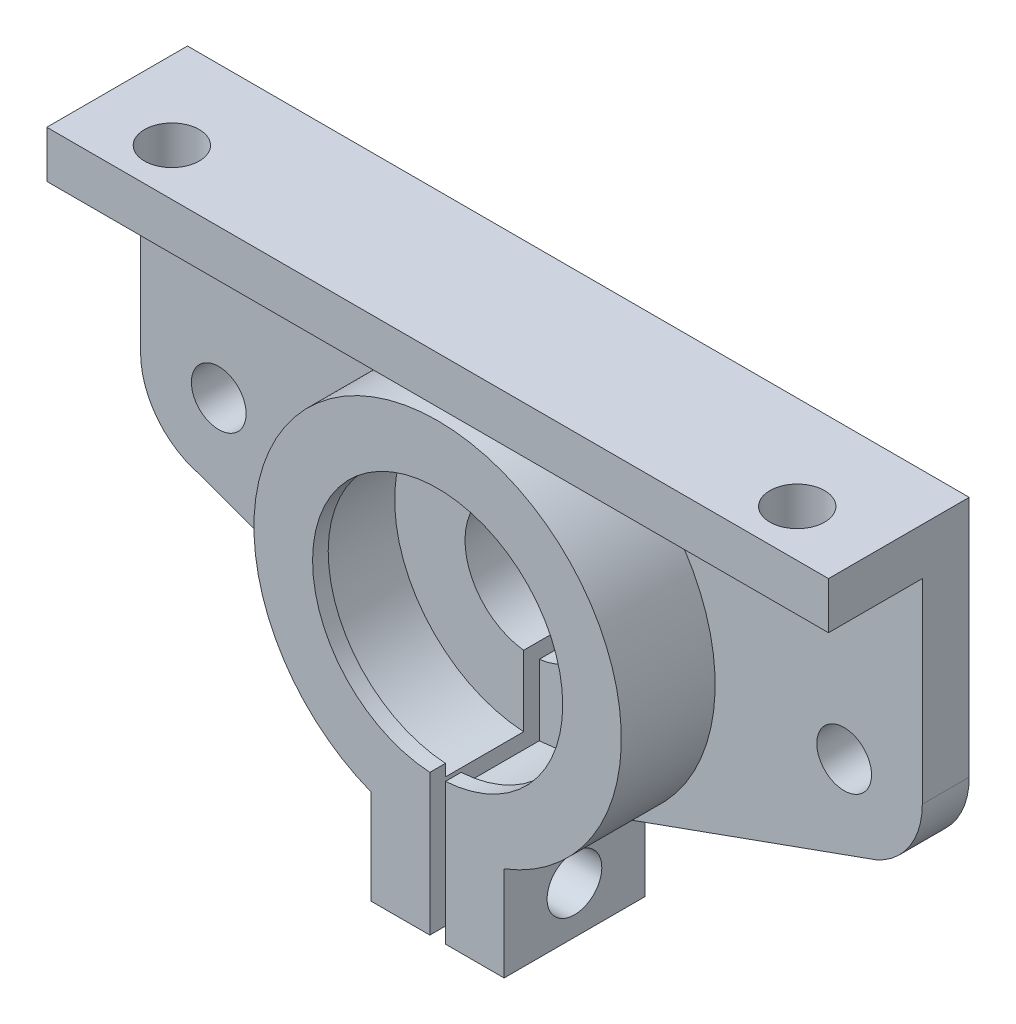
ISO-10303-21;
HEADER;
FILE_DESCRIPTION(('STEP AP214'),'2;1');
FILE_NAME('part.step','',(''),(''),'','','');
FILE_SCHEMA(('AUTOMOTIVE_DESIGN { 1 0 10303 214 1 1 1 1 }'));
ENDSEC;
DATA;
#1=APPLICATION_CONTEXT('core data for automotive mechanical design processes');
#2=APPLICATION_PROTOCOL_DEFINITION('international standard','automotive_design',2000,#1);
#3=PRODUCT_CONTEXT('',#1,'mechanical');
#4=PRODUCT('Part','Part','',(#3));
#5=PRODUCT_RELATED_PRODUCT_CATEGORY('part','',(#4));
#6=PRODUCT_DEFINITION_FORMATION('','',#4);
#7=PRODUCT_DEFINITION_CONTEXT('part definition',#1,'design');
#8=PRODUCT_DEFINITION('design','',#6,#7);
#9=PRODUCT_DEFINITION_SHAPE('','',#8);
#10=(LENGTH_UNIT() NAMED_UNIT(*) SI_UNIT(.MILLI.,.METRE.));
#11=(NAMED_UNIT(*) PLANE_ANGLE_UNIT() SI_UNIT($,.RADIAN.));
#12=(NAMED_UNIT(*) SI_UNIT($,.STERADIAN.) SOLID_ANGLE_UNIT());
#13=UNCERTAINTY_MEASURE_WITH_UNIT(LENGTH_MEASURE(1.E-05),#10,'distance_accuracy_value','');
#14=(GEOMETRIC_REPRESENTATION_CONTEXT(3) GLOBAL_UNCERTAINTY_ASSIGNED_CONTEXT((#13)) GLOBAL_UNIT_ASSIGNED_CONTEXT((#10,
#11,#12)) REPRESENTATION_CONTEXT('',''));
#15=CARTESIAN_POINT('',(0.,0.,0.));
#16=DIRECTION('',(0.,0.,1.));
#17=DIRECTION('',(1.,0.,0.));
#18=AXIS2_PLACEMENT_3D('',#15,#16,#17);
#19=CARTESIAN_POINT('',(0.,-34.,6.));
#20=DIRECTION('',(0.,1.,0.));
#21=DIRECTION('',(0.,0.,1.));
#22=AXIS2_PLACEMENT_3D('',#19,#20,#21);
#23=PLANE('',#22);
#24=DIRECTION('',(1.,0.,0.));
#25=VECTOR('',#24,1.);
#26=CARTESIAN_POINT('',(-8.5,-34.,18.));
#27=LINE('',#26,#25);
#28=CARTESIAN_POINT('',(1.00000000000001,-34.,18.));
#29=VERTEX_POINT('',#28);
#30=CARTESIAN_POINT('',(8.5,-34.,18.));
#31=VERTEX_POINT('',#30);
#32=EDGE_CURVE('E350',#29,#31,#27,.T.);
#33=ORIENTED_EDGE('',*,*,#32,.F.);
#34=DIRECTION('',(0.,0.,1.));
#35=VECTOR('',#34,1.);
#36=CARTESIAN_POINT('',(1.00000000000001,-34.,-1.2E-05));
#37=LINE('',#36,#35);
#38=CARTESIAN_POINT('',(1.00000000000001,-34.,0.));
#39=VERTEX_POINT('',#38);
#40=EDGE_CURVE('E208',#39,#29,#37,.T.);
#41=ORIENTED_EDGE('',*,*,#40,.F.);
#42=DIRECTION('',(1.,0.,0.));
#43=VECTOR('',#42,1.);
#44=CARTESIAN_POINT('',(0.,-34.,0.));
#45=LINE('',#44,#43);
#46=CARTESIAN_POINT('',(8.5,-34.,0.));
#47=VERTEX_POINT('',#46);
#48=EDGE_CURVE('E228',#39,#47,#45,.T.);
#49=ORIENTED_EDGE('',*,*,#48,.T.);
#50=DIRECTION('',(0.,0.,-1.));
#51=VECTOR('',#50,1.);
#52=CARTESIAN_POINT('',(8.5,-34.,6.));
#53=LINE('',#52,#51);
#54=EDGE_CURVE('E249',#31,#47,#53,.T.);
#55=ORIENTED_EDGE('',*,*,#54,.F.);
#56=EDGE_LOOP('',(#33,#41,#49,#55));
#57=FACE_BOUND('',#56,.T.);
#58=ADVANCED_FACE('F42',(#57),#23,.F.);
#59=CARTESIAN_POINT('',(0.,0.,18.));
#60=DIRECTION('',(0.,0.,1.));
#61=DIRECTION('',(1.,0.,0.));
#62=AXIS2_PLACEMENT_3D('',#59,#60,#61);
#63=CYLINDRICAL_SURFACE('',#62,16.);
#64=DIRECTION('',(0.,0.,1.));
#65=VECTOR('',#64,1.);
#66=CARTESIAN_POINT('',(1.,-15.9687194226713,18.));
#67=LINE('',#66,#65);
#68=CARTESIAN_POINT('',(1.,-15.9687194226713,18.));
#69=VERTEX_POINT('',#68);
#70=CARTESIAN_POINT('',(1.,-15.9687194226713,16.));
#71=VERTEX_POINT('',#70);
#72=EDGE_CURVE('E59',#69,#71,#67,.F.);
#73=ORIENTED_EDGE('',*,*,#72,.F.);
#74=CARTESIAN_POINT('',(0.,0.,18.));
#75=DIRECTION('',(0.,0.,1.));
#76=DIRECTION('',(1.,0.,0.));
#77=AXIS2_PLACEMENT_3D('',#74,#75,#76);
#78=CIRCLE('',#77,16.);
#79=CARTESIAN_POINT('',(16.,0.,18.));
#80=VERTEX_POINT('',#79);
#81=EDGE_CURVE('E334',#69,#80,#78,.T.);
#82=ORIENTED_EDGE('',*,*,#81,.T.);
#83=DIRECTION('',(0.,0.,1.));
#84=VECTOR('',#83,1.);
#85=CARTESIAN_POINT('',(16.,0.,18.));
#86=LINE('',#85,#84);
#87=CARTESIAN_POINT('',(16.,0.,16.));
#88=VERTEX_POINT('',#87);
#89=EDGE_CURVE('E264',#88,#80,#86,.T.);
#90=ORIENTED_EDGE('',*,*,#89,.F.);
#91=CARTESIAN_POINT('',(0.,0.,16.));
#92=DIRECTION('',(0.,0.,1.));
#93=DIRECTION('',(1.,0.,0.));
#94=AXIS2_PLACEMENT_3D('',#91,#92,#93);
#95=CIRCLE('',#94,16.);
#96=EDGE_CURVE('E263',#71,#88,#95,.T.);
#97=ORIENTED_EDGE('',*,*,#96,.F.);
#98=EDGE_LOOP('',(#73,#82,#90,#97));
#99=FACE_BOUND('',#98,.T.);
#100=ADVANCED_FACE('F454',(#99),#63,.F.);
#101=CARTESIAN_POINT('',(17.5,0.,16.));
#102=DIRECTION('',(0.,0.,-1.));
#103=DIRECTION('',(-1.,0.,0.));
#104=AXIS2_PLACEMENT_3D('',#101,#102,#103);
#105=PLANE('',#104);
#106=DIRECTION('',(0.,-1.,0.));
#107=VECTOR('',#106,1.);
#108=CARTESIAN_POINT('',(1.,0.,16.));
#109=LINE('',#108,#107);
#110=CARTESIAN_POINT('',(1.00000000000001,-17.4714052096562,16.));
#111=VERTEX_POINT('',#110);
#112=EDGE_CURVE('E291',#71,#111,#109,.T.);
#113=ORIENTED_EDGE('',*,*,#112,.F.);
#114=ORIENTED_EDGE('',*,*,#96,.T.);
#115=DIRECTION('',(-1.,0.,0.));
#116=VECTOR('',#115,1.);
#117=CARTESIAN_POINT('',(17.5,0.,16.));
#118=LINE('',#117,#116);
#119=CARTESIAN_POINT('',(17.5,0.,16.));
#120=VERTEX_POINT('',#119);
#121=EDGE_CURVE('E328',#120,#88,#118,.T.);
#122=ORIENTED_EDGE('',*,*,#121,.F.);
#123=CARTESIAN_POINT('',(0.,0.,16.));
#124=DIRECTION('',(0.,0.,-1.));
#125=DIRECTION('',(-1.,0.,0.));
#126=AXIS2_PLACEMENT_3D('',#123,#124,#125);
#127=CIRCLE('',#126,17.5);
#128=EDGE_CURVE('E11',#120,#111,#127,.T.);
#129=ORIENTED_EDGE('',*,*,#128,.T.);
#130=EDGE_LOOP('',(#113,#114,#122,#129));
#131=FACE_BOUND('',#130,.T.);
#132=ADVANCED_FACE('F460',(#131),#105,.T.);
#133=CARTESIAN_POINT('',(-50.,-28.,9.));
#134=DIRECTION('',(1.,0.,0.));
#135=DIRECTION('',(0.,0.,-1.));
#136=AXIS2_PLACEMENT_3D('',#133,#134,#135);
#137=CYLINDRICAL_SURFACE('',#136,3.5);
#138=CARTESIAN_POINT('',(1.00000000000001,-28.,9.));
#139=DIRECTION('',(1.,0.,0.));
#140=DIRECTION('',(0.,1.,0.));
#141=AXIS2_PLACEMENT_3D('',#138,#139,#140);
#142=CIRCLE('',#141,3.5);
#143=CARTESIAN_POINT('',(1.00000000000001,-24.5,9.));
#144=VERTEX_POINT('',#143);
#145=EDGE_CURVE('E46',#144,#144,#142,.F.);
#146=ORIENTED_EDGE('',*,*,#145,.T.);
#147=EDGE_LOOP('',(#146));
#148=FACE_BOUND('',#147,.T.);
#149=CARTESIAN_POINT('',(8.50000000000001,-28.,9.));
#150=DIRECTION('',(-1.,0.,0.));
#151=DIRECTION('',(0.,0.,1.));
#152=AXIS2_PLACEMENT_3D('',#149,#150,#151);
#153=CIRCLE('',#152,3.5);
#154=CARTESIAN_POINT('',(8.50000000000001,-28.,12.5));
#155=VERTEX_POINT('',#154);
#156=EDGE_CURVE('E267',#155,#155,#153,.T.);
#157=ORIENTED_EDGE('',*,*,#156,.F.);
#158=EDGE_LOOP('',(#157));
#159=FACE_BOUND('',#158,.T.);
#160=ADVANCED_FACE('F522',(#148,#159),#137,.F.);
#161=CARTESIAN_POINT('',(0.,0.,6.));
#162=DIRECTION('',(0.,0.,1.));
#163=DIRECTION('',(1.,0.,0.));
#164=AXIS2_PLACEMENT_3D('',#161,#162,#163);
#165=PLANE('',#164);
#166=DIRECTION('',(0.,1.,0.));
#167=VECTOR('',#166,1.);
#168=CARTESIAN_POINT('',(1.,0.,6.));
#169=LINE('',#168,#167);
#170=CARTESIAN_POINT('',(1.,-17.4714052096561,6.));
#171=VERTEX_POINT('',#170);
#172=CARTESIAN_POINT('',(1.,-8.44097150806707,6.));
#173=VERTEX_POINT('',#172);
#174=EDGE_CURVE('E298',#171,#173,#169,.T.);
#175=ORIENTED_EDGE('',*,*,#174,.F.);
#176=CARTESIAN_POINT('',(0.,0.,6.));
#177=DIRECTION('',(0.,0.,1.));
#178=DIRECTION('',(1.,0.,0.));
#179=AXIS2_PLACEMENT_3D('',#176,#177,#178);
#180=CIRCLE('',#179,17.5);
#181=CARTESIAN_POINT('',(-0.999999999999997,-17.4714052096561,6.));
#182=VERTEX_POINT('',#181);
#183=EDGE_CURVE('E340',#171,#182,#180,.T.);
#184=ORIENTED_EDGE('',*,*,#183,.T.);
#185=DIRECTION('',(0.,-1.,0.));
#186=VECTOR('',#185,1.);
#187=CARTESIAN_POINT('',(-1.,0.,6.));
#188=LINE('',#187,#186);
#189=CARTESIAN_POINT('',(-0.999999999999999,-8.44097150806707,6.));
#190=VERTEX_POINT('',#189);
#191=EDGE_CURVE('E288',#190,#182,#188,.T.);
#192=ORIENTED_EDGE('',*,*,#191,.F.);
#193=CARTESIAN_POINT('',(0.,0.,6.));
#194=DIRECTION('',(0.,0.,1.));
#195=DIRECTION('',(1.,0.,0.));
#196=AXIS2_PLACEMENT_3D('',#193,#194,#195);
#197=CIRCLE('',#196,8.5);
#198=EDGE_CURVE('E242',#173,#190,#197,.T.);
#199=ORIENTED_EDGE('',*,*,#198,.F.);
#200=EDGE_LOOP('',(#175,#184,#192,#199));
#201=FACE_BOUND('',#200,.T.);
#202=ADVANCED_FACE('F476',(#201),#165,.T.);
#203=CARTESIAN_POINT('',(40.,0.,6.));
#204=DIRECTION('',(0.,0.,-1.));
#205=DIRECTION('',(-1.,0.,0.));
#206=AXIS2_PLACEMENT_3D('',#203,#204,#205);
#207=CYLINDRICAL_SURFACE('',#206,10.);
#208=CARTESIAN_POINT('',(40.,0.,0.));
#209=DIRECTION('',(0.,0.,1.));
#210=DIRECTION('',(1.,0.,0.));
#211=AXIS2_PLACEMENT_3D('',#208,#209,#210);
#212=CIRCLE('',#211,10.);
#213=CARTESIAN_POINT('',(50.,0.,0.));
#214=VERTEX_POINT('',#213);
#215=CARTESIAN_POINT('',(44.1949368353274,-9.07758254975484,0.));
#216=VERTEX_POINT('',#215);
#217=EDGE_CURVE('E392',#214,#216,#212,.F.);
#218=ORIENTED_EDGE('',*,*,#217,.F.);
#219=DIRECTION('',(0.,0.,-1.));
#220=VECTOR('',#219,1.);
#221=CARTESIAN_POINT('',(50.,0.,6.));
#222=LINE('',#221,#220);
#223=CARTESIAN_POINT('',(50.,0.,6.));
#224=VERTEX_POINT('',#223);
#225=EDGE_CURVE('E259',#224,#214,#222,.T.);
#226=ORIENTED_EDGE('',*,*,#225,.F.);
#227=CARTESIAN_POINT('',(40.,0.,6.));
#228=DIRECTION('',(0.,0.,1.));
#229=DIRECTION('',(1.,0.,0.));
#230=AXIS2_PLACEMENT_3D('',#227,#228,#229);
#231=CIRCLE('',#230,10.);
#232=CARTESIAN_POINT('',(44.1949368353274,-9.07758254975484,6.));
#233=VERTEX_POINT('',#232);
#234=EDGE_CURVE('E368',#224,#233,#231,.F.);
#235=ORIENTED_EDGE('',*,*,#234,.T.);
#236=DIRECTION('',(0.,0.,-1.));
#237=VECTOR('',#236,1.);
#238=CARTESIAN_POINT('',(44.1949368353274,-9.07758254975484,6.));
#239=LINE('',#238,#237);
#240=EDGE_CURVE('E243',#233,#216,#239,.T.);
#241=ORIENTED_EDGE('',*,*,#240,.T.);
#242=EDGE_LOOP('',(#218,#226,#235,#241));
#243=FACE_BOUND('',#242,.T.);
#244=ADVANCED_FACE('F431',(#243),#207,.T.);
#245=CARTESIAN_POINT('',(50.,0.,6.));
#246=DIRECTION('',(-1.,0.,0.));
#247=DIRECTION('',(0.,0.,1.));
#248=AXIS2_PLACEMENT_3D('',#245,#246,#247);
#249=PLANE('',#248);
#250=DIRECTION('',(0.,1.,0.));
#251=VECTOR('',#250,1.);
#252=CARTESIAN_POINT('',(50.,0.,0.));
#253=LINE('',#252,#251);
#254=CARTESIAN_POINT('',(50.,31.,0.));
#255=VERTEX_POINT('',#254);
#256=EDGE_CURVE('E395',#214,#255,#253,.T.);
#257=ORIENTED_EDGE('',*,*,#256,.T.);
#258=DIRECTION('',(0.,0.,1.));
#259=VECTOR('',#258,1.);
#260=CARTESIAN_POINT('',(50.,31.,0.));
#261=LINE('',#260,#259);
#262=CARTESIAN_POINT('',(50.,31.,18.));
#263=VERTEX_POINT('',#262);
#264=EDGE_CURVE('E313',#255,#263,#261,.T.);
#265=ORIENTED_EDGE('',*,*,#264,.T.);
#266=DIRECTION('',(0.,-1.,0.));
#267=VECTOR('',#266,1.);
#268=CARTESIAN_POINT('',(50.,25.,18.));
#269=LINE('',#268,#267);
#270=CARTESIAN_POINT('',(50.,25.,18.));
#271=VERTEX_POINT('',#270);
#272=EDGE_CURVE('E315',#263,#271,#269,.T.);
#273=ORIENTED_EDGE('',*,*,#272,.T.);
#274=DIRECTION('',(0.,0.,-1.));
#275=VECTOR('',#274,1.);
#276=CARTESIAN_POINT('',(50.,25.,0.));
#277=LINE('',#276,#275);
#278=CARTESIAN_POINT('',(50.,25.,6.));
#279=VERTEX_POINT('',#278);
#280=EDGE_CURVE('E317',#271,#279,#277,.T.);
#281=ORIENTED_EDGE('',*,*,#280,.T.);
#282=DIRECTION('',(0.,1.,0.));
#283=VECTOR('',#282,1.);
#284=CARTESIAN_POINT('',(50.,0.,6.));
#285=LINE('',#284,#283);
#286=EDGE_CURVE('E371',#224,#279,#285,.T.);
#287=ORIENTED_EDGE('',*,*,#286,.F.);
#288=ORIENTED_EDGE('',*,*,#225,.T.);
#289=EDGE_LOOP('',(#257,#265,#273,#281,#287,#288));
#290=FACE_BOUND('',#289,.T.);
#291=ADVANCED_FACE('F515',(#290),#249,.F.);
#292=CARTESIAN_POINT('',(-50.,0.,6.));
#293=DIRECTION('',(-1.,0.,0.));
#294=DIRECTION('',(0.,0.,1.));
#295=AXIS2_PLACEMENT_3D('',#292,#293,#294);
#296=PLANE('',#295);
#297=DIRECTION('',(0.,1.,0.));
#298=VECTOR('',#297,1.);
#299=CARTESIAN_POINT('',(-50.,0.,0.));
#300=LINE('',#299,#298);
#301=CARTESIAN_POINT('',(-50.,0.,0.));
#302=VERTEX_POINT('',#301);
#303=CARTESIAN_POINT('',(-50.,31.,0.));
#304=VERTEX_POINT('',#303);
#305=EDGE_CURVE('E397',#302,#304,#300,.T.);
#306=ORIENTED_EDGE('',*,*,#305,.F.);
#307=DIRECTION('',(0.,0.,-1.));
#308=VECTOR('',#307,1.);
#309=CARTESIAN_POINT('',(-50.,0.,6.));
#310=LINE('',#309,#308);
#311=CARTESIAN_POINT('',(-50.,0.,6.));
#312=VERTEX_POINT('',#311);
#313=EDGE_CURVE('E257',#312,#302,#310,.T.);
#314=ORIENTED_EDGE('',*,*,#313,.F.);
#315=DIRECTION('',(0.,1.,0.));
#316=VECTOR('',#315,1.);
#317=CARTESIAN_POINT('',(-50.,0.,6.));
#318=LINE('',#317,#316);
#319=CARTESIAN_POINT('',(-50.,25.,6.));
#320=VERTEX_POINT('',#319);
#321=EDGE_CURVE('E376',#312,#320,#318,.T.);
#322=ORIENTED_EDGE('',*,*,#321,.T.);
#323=DIRECTION('',(0.,0.,-1.));
#324=VECTOR('',#323,1.);
#325=CARTESIAN_POINT('',(-50.,25.,0.));
#326=LINE('',#325,#324);
#327=CARTESIAN_POINT('',(-50.,25.,18.));
#328=VERTEX_POINT('',#327);
#329=EDGE_CURVE('E310',#328,#320,#326,.T.);
#330=ORIENTED_EDGE('',*,*,#329,.F.);
#331=DIRECTION('',(0.,-1.,0.));
#332=VECTOR('',#331,1.);
#333=CARTESIAN_POINT('',(-50.,25.,18.));
#334=LINE('',#333,#332);
#335=CARTESIAN_POINT('',(-50.,31.,18.));
#336=VERTEX_POINT('',#335);
#337=EDGE_CURVE('E307',#336,#328,#334,.T.);
#338=ORIENTED_EDGE('',*,*,#337,.F.);
#339=DIRECTION('',(0.,0.,1.));
#340=VECTOR('',#339,1.);
#341=CARTESIAN_POINT('',(-50.,31.,0.));
#342=LINE('',#341,#340);
#343=EDGE_CURVE('E304',#304,#336,#342,.T.);
#344=ORIENTED_EDGE('',*,*,#343,.F.);
#345=EDGE_LOOP('',(#306,#314,#322,#330,#338,#344));
#346=FACE_BOUND('',#345,.T.);
#347=ADVANCED_FACE('F419',(#346),#296,.T.);
#348=CARTESIAN_POINT('',(-40.,0.,6.));
#349=DIRECTION('',(0.,0.,-1.));
#350=DIRECTION('',(-1.,0.,0.));
#351=AXIS2_PLACEMENT_3D('',#348,#349,#350);
#352=CYLINDRICAL_SURFACE('',#351,10.);
#353=CARTESIAN_POINT('',(-40.,0.,0.));
#354=DIRECTION('',(0.,0.,1.));
#355=DIRECTION('',(1.,0.,0.));
#356=AXIS2_PLACEMENT_3D('',#353,#354,#355);
#357=CIRCLE('',#356,10.);
#358=CARTESIAN_POINT('',(-44.1949368353274,-9.07758254975484,0.));
#359=VERTEX_POINT('',#358);
#360=EDGE_CURVE('E399',#302,#359,#357,.T.);
#361=ORIENTED_EDGE('',*,*,#360,.T.);
#362=DIRECTION('',(0.,0.,-1.));
#363=VECTOR('',#362,1.);
#364=CARTESIAN_POINT('',(-44.1949368353274,-9.07758254975484,6.));
#365=LINE('',#364,#363);
#366=CARTESIAN_POINT('',(-44.1949368353274,-9.07758254975484,6.));
#367=VERTEX_POINT('',#366);
#368=EDGE_CURVE('E255',#367,#359,#365,.T.);
#369=ORIENTED_EDGE('',*,*,#368,.F.);
#370=CARTESIAN_POINT('',(-40.,0.,6.));
#371=DIRECTION('',(0.,0.,1.));
#372=DIRECTION('',(1.,0.,0.));
#373=AXIS2_PLACEMENT_3D('',#370,#371,#372);
#374=CIRCLE('',#373,10.);
#375=EDGE_CURVE('E379',#312,#367,#374,.T.);
#376=ORIENTED_EDGE('',*,*,#375,.F.);
#377=ORIENTED_EDGE('',*,*,#313,.T.);
#378=EDGE_LOOP('',(#361,#369,#376,#377));
#379=FACE_BOUND('',#378,.T.);
#380=ADVANCED_FACE('F414',(#379),#352,.T.);
#381=CARTESIAN_POINT('',(-7.9470788503936,-22.1076618077558,6.));
#382=DIRECTION('',(-0.338279318630022,-0.941045749465565,0.));
#383=DIRECTION('',(0.941045749465566,-0.338279318630022,0.));
#384=AXIS2_PLACEMENT_3D('',#381,#382,#383);
#385=PLANE('',#384);
#386=DIRECTION('',(-0.941045749465566,0.338279318630022,0.));
#387=VECTOR('',#386,1.);
#388=CARTESIAN_POINT('',(-7.9470788503936,-22.1076618077558,0.));
#389=LINE('',#388,#387);
#390=CARTESIAN_POINT('',(-8.5,-21.9089023002066,0.));
#391=VERTEX_POINT('',#390);
#392=EDGE_CURVE('E401',#391,#359,#389,.T.);
#393=ORIENTED_EDGE('',*,*,#392,.F.);
#394=DIRECTION('',(0.,0.,-1.));
#395=VECTOR('',#394,1.);
#396=CARTESIAN_POINT('',(-8.5,-21.9089023002066,6.));
#397=LINE('',#396,#395);
#398=CARTESIAN_POINT('',(-8.5,-21.9089023002066,6.));
#399=VERTEX_POINT('',#398);
#400=EDGE_CURVE('E253',#399,#391,#397,.T.);
#401=ORIENTED_EDGE('',*,*,#400,.F.);
#402=DIRECTION('',(-0.941045749465566,0.338279318630022,0.));
#403=VECTOR('',#402,1.);
#404=CARTESIAN_POINT('',(-7.9470788503936,-22.1076618077558,6.));
#405=LINE('',#404,#403);
#406=EDGE_CURVE('E381',#399,#367,#405,.T.);
#407=ORIENTED_EDGE('',*,*,#406,.T.);
#408=ORIENTED_EDGE('',*,*,#368,.T.);
#409=EDGE_LOOP('',(#393,#401,#407,#408));
#410=FACE_BOUND('',#409,.T.);
#411=ADVANCED_FACE('F410',(#410),#385,.T.);
#412=CARTESIAN_POINT('',(-8.5,0.,6.));
#413=DIRECTION('',(-1.,0.,0.));
#414=DIRECTION('',(0.,0.,1.));
#415=AXIS2_PLACEMENT_3D('',#412,#413,#414);
#416=PLANE('',#415);
#417=CARTESIAN_POINT('',(-8.49999999999999,-28.,9.));
#418=DIRECTION('',(-1.,0.,0.));
#419=DIRECTION('',(0.,0.,1.));
#420=AXIS2_PLACEMENT_3D('',#417,#418,#419);
#421=CIRCLE('',#420,3.5);
#422=CARTESIAN_POINT('',(-8.49999999999999,-28.,12.5));
#423=VERTEX_POINT('',#422);
#424=EDGE_CURVE('E269',#423,#423,#421,.T.);
#425=ORIENTED_EDGE('',*,*,#424,.F.);
#426=EDGE_LOOP('',(#425));
#427=FACE_BOUND('',#426,.T.);
#428=DIRECTION('',(0.,1.,0.));
#429=VECTOR('',#428,1.);
#430=CARTESIAN_POINT('',(-8.5,0.,0.));
#431=LINE('',#430,#429);
#432=CARTESIAN_POINT('',(-8.5,-34.,0.));
#433=VERTEX_POINT('',#432);
#434=EDGE_CURVE('E233',#433,#391,#431,.T.);
#435=ORIENTED_EDGE('',*,*,#434,.F.);
#436=DIRECTION('',(0.,0.,-1.));
#437=VECTOR('',#436,1.);
#438=CARTESIAN_POINT('',(-8.5,-34.,6.));
#439=LINE('',#438,#437);
#440=CARTESIAN_POINT('',(-8.5,-34.,18.));
#441=VERTEX_POINT('',#440);
#442=EDGE_CURVE('E226',#441,#433,#439,.T.);
#443=ORIENTED_EDGE('',*,*,#442,.F.);
#444=DIRECTION('',(0.,-1.,0.));
#445=VECTOR('',#444,1.);
#446=CARTESIAN_POINT('',(-8.5,-34.,18.));
#447=LINE('',#446,#445);
#448=CARTESIAN_POINT('',(-8.5,-21.9089023002066,18.));
#449=VERTEX_POINT('',#448);
#450=EDGE_CURVE('E347',#449,#441,#447,.T.);
#451=ORIENTED_EDGE('',*,*,#450,.F.);
#452=DIRECTION('',(0.,0.,-1.));
#453=VECTOR('',#452,1.);
#454=CARTESIAN_POINT('',(-8.5,-21.9089023002066,18.));
#455=LINE('',#454,#453);
#456=EDGE_CURVE('E360',#449,#399,#455,.T.);
#457=ORIENTED_EDGE('',*,*,#456,.T.);
#458=ORIENTED_EDGE('',*,*,#400,.T.);
#459=EDGE_LOOP('',(#435,#443,#451,#457,#458));
#460=FACE_BOUND('',#459,.T.);
#461=ADVANCED_FACE('F406',(#427,#460),#416,.T.);
#462=CARTESIAN_POINT('',(-0.999999999999996,-34.,0.));
#463=VERTEX_POINT('',#462);
#464=EDGE_CURVE('E218',#433,#463,#45,.T.);
#465=ORIENTED_EDGE('',*,*,#464,.T.);
#466=DIRECTION('',(0.,0.,1.));
#467=VECTOR('',#466,1.);
#468=CARTESIAN_POINT('',(-0.999999999999996,-34.,-1.2E-05));
#469=LINE('',#468,#467);
#470=CARTESIAN_POINT('',(-0.999999999999996,-34.,18.));
#471=VERTEX_POINT('',#470);
#472=EDGE_CURVE('E197',#463,#471,#469,.T.);
#473=ORIENTED_EDGE('',*,*,#472,.T.);
#474=EDGE_CURVE('E351',#441,#471,#27,.T.);
#475=ORIENTED_EDGE('',*,*,#474,.F.);
#476=ORIENTED_EDGE('',*,*,#442,.T.);
#477=EDGE_LOOP('',(#465,#473,#475,#476));
#478=FACE_BOUND('',#477,.T.);
#479=ADVANCED_FACE('F225',(#478),#23,.F.);
#480=CARTESIAN_POINT('',(8.5,0.,6.));
#481=DIRECTION('',(-1.,0.,0.));
#482=DIRECTION('',(0.,0.,1.));
#483=AXIS2_PLACEMENT_3D('',#480,#481,#482);
#484=PLANE('',#483);
#485=ORIENTED_EDGE('',*,*,#156,.T.);
#486=EDGE_LOOP('',(#485));
#487=FACE_BOUND('',#486,.T.);
#488=DIRECTION('',(0.,1.,0.));
#489=VECTOR('',#488,1.);
#490=CARTESIAN_POINT('',(8.5,0.,0.));
#491=LINE('',#490,#489);
#492=CARTESIAN_POINT('',(8.5,-21.9089023002066,0.));
#493=VERTEX_POINT('',#492);
#494=EDGE_CURVE('E227',#47,#493,#491,.T.);
#495=ORIENTED_EDGE('',*,*,#494,.T.);
#496=DIRECTION('',(0.,0.,-1.));
#497=VECTOR('',#496,1.);
#498=CARTESIAN_POINT('',(8.5,-21.9089023002066,6.));
#499=LINE('',#498,#497);
#500=CARTESIAN_POINT('',(8.5,-21.9089023002066,6.));
#501=VERTEX_POINT('',#500);
#502=EDGE_CURVE('E245',#501,#493,#499,.T.);
#503=ORIENTED_EDGE('',*,*,#502,.F.);
#504=DIRECTION('',(0.,0.,-1.));
#505=VECTOR('',#504,1.);
#506=CARTESIAN_POINT('',(8.5,-21.9089023002066,18.));
#507=LINE('',#506,#505);
#508=CARTESIAN_POINT('',(8.5,-21.9089023002066,18.));
#509=VERTEX_POINT('',#508);
#510=EDGE_CURVE('E355',#509,#501,#507,.T.);
#511=ORIENTED_EDGE('',*,*,#510,.F.);
#512=DIRECTION('',(0.,1.,0.));
#513=VECTOR('',#512,1.);
#514=CARTESIAN_POINT('',(8.5,-34.,18.));
#515=LINE('',#514,#513);
#516=EDGE_CURVE('E353',#31,#509,#515,.T.);
#517=ORIENTED_EDGE('',*,*,#516,.F.);
#518=ORIENTED_EDGE('',*,*,#54,.T.);
#519=EDGE_LOOP('',(#495,#503,#511,#517,#518));
#520=FACE_BOUND('',#519,.T.);
#521=ADVANCED_FACE('F443',(#487,#520),#484,.F.);
#522=CARTESIAN_POINT('',(7.9470788503936,-22.1076618077558,6.));
#523=DIRECTION('',(-0.338279318630022,0.941045749465565,0.));
#524=DIRECTION('',(-0.941045749465566,-0.338279318630022,0.));
#525=AXIS2_PLACEMENT_3D('',#522,#523,#524);
#526=PLANE('',#525);
#527=DIRECTION('',(0.941045749465566,0.338279318630022,0.));
#528=VECTOR('',#527,1.);
#529=CARTESIAN_POINT('',(7.9470788503936,-22.1076618077558,0.));
#530=LINE('',#529,#528);
#531=EDGE_CURVE('E231',#493,#216,#530,.T.);
#532=ORIENTED_EDGE('',*,*,#531,.T.);
#533=ORIENTED_EDGE('',*,*,#240,.F.);
#534=DIRECTION('',(0.941045749465566,0.338279318630022,0.));
#535=VECTOR('',#534,1.);
#536=CARTESIAN_POINT('',(7.9470788503936,-22.1076618077558,6.));
#537=LINE('',#536,#535);
#538=EDGE_CURVE('E384',#501,#233,#537,.T.);
#539=ORIENTED_EDGE('',*,*,#538,.F.);
#540=ORIENTED_EDGE('',*,*,#502,.T.);
#541=EDGE_LOOP('',(#532,#533,#539,#540));
#542=FACE_BOUND('',#541,.T.);
#543=ADVANCED_FACE('F437',(#542),#526,.F.);
#544=CARTESIAN_POINT('',(-40.,0.,6.));
#545=DIRECTION('',(0.,0.,-1.));
#546=DIRECTION('',(-1.,0.,0.));
#547=AXIS2_PLACEMENT_3D('',#544,#545,#546);
#548=CYLINDRICAL_SURFACE('',#547,3.5);
#549=CARTESIAN_POINT('',(-40.,0.,6.));
#550=DIRECTION('',(0.,0.,1.));
#551=DIRECTION('',(1.,0.,0.));
#552=AXIS2_PLACEMENT_3D('',#549,#550,#551);
#553=CIRCLE('',#552,3.5);
#554=CARTESIAN_POINT('',(-36.5,0.,6.));
#555=VERTEX_POINT('',#554);
#556=EDGE_CURVE('E365',#555,#555,#553,.T.);
#557=ORIENTED_EDGE('',*,*,#556,.T.);
#558=EDGE_LOOP('',(#557));
#559=FACE_BOUND('',#558,.T.);
#560=CARTESIAN_POINT('',(-40.,0.,0.));
#561=DIRECTION('',(0.,0.,1.));
#562=DIRECTION('',(1.,0.,0.));
#563=AXIS2_PLACEMENT_3D('',#560,#561,#562);
#564=CIRCLE('',#563,3.5);
#565=CARTESIAN_POINT('',(-36.5,0.,0.));
#566=VERTEX_POINT('',#565);
#567=EDGE_CURVE('E389',#566,#566,#564,.T.);
#568=ORIENTED_EDGE('',*,*,#567,.F.);
#569=EDGE_LOOP('',(#568));
#570=FACE_BOUND('',#569,.T.);
#571=ADVANCED_FACE('F481',(#559,#570),#548,.F.);
#572=CARTESIAN_POINT('',(0.,0.,6.));
#573=DIRECTION('',(0.,0.,-1.));
#574=DIRECTION('',(-1.,0.,0.));
#575=AXIS2_PLACEMENT_3D('',#572,#573,#574);
#576=CYLINDRICAL_SURFACE('',#575,8.5);
#577=DIRECTION('',(0.,0.,-1.));
#578=VECTOR('',#577,1.);
#579=CARTESIAN_POINT('',(1.,-8.44097150806707,6.));
#580=LINE('',#579,#578);
#581=CARTESIAN_POINT('',(1.,-8.44097150806707,0.));
#582=VERTEX_POINT('',#581);
#583=EDGE_CURVE('E300',#173,#582,#580,.T.);
#584=ORIENTED_EDGE('',*,*,#583,.F.);
#585=ORIENTED_EDGE('',*,*,#198,.T.);
#586=DIRECTION('',(0.,0.,-1.));
#587=VECTOR('',#586,1.);
#588=CARTESIAN_POINT('',(-0.999999999999999,-8.44097150806707,6.));
#589=LINE('',#588,#587);
#590=CARTESIAN_POINT('',(-0.999999999999999,-8.44097150806707,0.));
#591=VERTEX_POINT('',#590);
#592=EDGE_CURVE('E223',#591,#190,#589,.F.);
#593=ORIENTED_EDGE('',*,*,#592,.F.);
#594=CARTESIAN_POINT('',(0.,0.,0.));
#595=DIRECTION('',(0.,0.,1.));
#596=DIRECTION('',(1.,0.,0.));
#597=AXIS2_PLACEMENT_3D('',#594,#595,#596);
#598=CIRCLE('',#597,8.5);
#599=EDGE_CURVE('E222',#582,#591,#598,.T.);
#600=ORIENTED_EDGE('',*,*,#599,.F.);
#601=EDGE_LOOP('',(#584,#585,#593,#600));
#602=FACE_BOUND('',#601,.T.);
#603=ADVANCED_FACE('F44',(#602),#576,.F.);
#604=CARTESIAN_POINT('',(40.,0.,6.));
#605=DIRECTION('',(0.,0.,-1.));
#606=DIRECTION('',(-1.,0.,0.));
#607=AXIS2_PLACEMENT_3D('',#604,#605,#606);
#608=CYLINDRICAL_SURFACE('',#607,3.5);
#609=CARTESIAN_POINT('',(40.,0.,6.));
#610=DIRECTION('',(0.,0.,1.));
#611=DIRECTION('',(1.,0.,0.));
#612=AXIS2_PLACEMENT_3D('',#609,#610,#611);
#613=CIRCLE('',#612,3.5);
#614=CARTESIAN_POINT('',(43.5,0.,6.));
#615=VERTEX_POINT('',#614);
#616=EDGE_CURVE('E246',#615,#615,#613,.F.);
#617=ORIENTED_EDGE('',*,*,#616,.F.);
#618=EDGE_LOOP('',(#617));
#619=FACE_BOUND('',#618,.T.);
#620=CARTESIAN_POINT('',(40.,0.,0.));
#621=DIRECTION('',(0.,0.,1.));
#622=DIRECTION('',(1.,0.,0.));
#623=AXIS2_PLACEMENT_3D('',#620,#621,#622);
#624=CIRCLE('',#623,3.5);
#625=CARTESIAN_POINT('',(43.5,0.,0.));
#626=VERTEX_POINT('',#625);
#627=EDGE_CURVE('E239',#626,#626,#624,.F.);
#628=ORIENTED_EDGE('',*,*,#627,.T.);
#629=EDGE_LOOP('',(#628));
#630=FACE_BOUND('',#629,.T.);
#631=ADVANCED_FACE('F480',(#619,#630),#608,.F.);
#632=CARTESIAN_POINT('',(0.,0.,6.));
#633=DIRECTION('',(0.,0.,1.));
#634=DIRECTION('',(1.,0.,0.));
#635=AXIS2_PLACEMENT_3D('',#632,#633,#634);
#636=CIRCLE('',#635,23.5);
#637=EDGE_CURVE('E343',#501,#399,#636,.T.);
#638=ORIENTED_EDGE('',*,*,#637,.F.);
#639=ORIENTED_EDGE('',*,*,#538,.T.);
#640=ORIENTED_EDGE('',*,*,#234,.F.);
#641=ORIENTED_EDGE('',*,*,#286,.T.);
#642=DIRECTION('',(1.,0.,0.));
#643=VECTOR('',#642,1.);
#644=CARTESIAN_POINT('',(0.,25.,6.));
#645=LINE('',#644,#643);
#646=EDGE_CURVE('E373',#320,#279,#645,.T.);
#647=ORIENTED_EDGE('',*,*,#646,.F.);
#648=ORIENTED_EDGE('',*,*,#321,.F.);
#649=ORIENTED_EDGE('',*,*,#375,.T.);
#650=ORIENTED_EDGE('',*,*,#406,.F.);
#651=EDGE_LOOP('',(#638,#639,#640,#641,#647,#648,#649,#650));
#652=FACE_BOUND('',#651,.T.);
#653=ORIENTED_EDGE('',*,*,#556,.F.);
#654=EDGE_LOOP('',(#653));
#655=FACE_BOUND('',#654,.T.);
#656=ORIENTED_EDGE('',*,*,#616,.T.);
#657=EDGE_LOOP('',(#656));
#658=FACE_BOUND('',#657,.T.);
#659=ADVANCED_FACE('F486',(#652,#655,#658),#165,.T.);
#660=CARTESIAN_POINT('',(0.,0.,0.));
#661=DIRECTION('',(0.,0.,1.));
#662=DIRECTION('',(1.,0.,0.));
#663=AXIS2_PLACEMENT_3D('',#660,#661,#662);
#664=PLANE('',#663);
#665=ORIENTED_EDGE('',*,*,#48,.F.);
#666=DIRECTION('',(0.,1.,0.));
#667=VECTOR('',#666,1.);
#668=CARTESIAN_POINT('',(1.,0.,0.));
#669=LINE('',#668,#667);
#670=EDGE_CURVE('E302',#39,#582,#669,.T.);
#671=ORIENTED_EDGE('',*,*,#670,.T.);
#672=ORIENTED_EDGE('',*,*,#599,.T.);
#673=DIRECTION('',(0.,-1.,0.));
#674=VECTOR('',#673,1.);
#675=CARTESIAN_POINT('',(-1.,0.,0.));
#676=LINE('',#675,#674);
#677=EDGE_CURVE('E200',#591,#463,#676,.T.);
#678=ORIENTED_EDGE('',*,*,#677,.T.);
#679=ORIENTED_EDGE('',*,*,#464,.F.);
#680=ORIENTED_EDGE('',*,*,#434,.T.);
#681=ORIENTED_EDGE('',*,*,#392,.T.);
#682=ORIENTED_EDGE('',*,*,#360,.F.);
#683=ORIENTED_EDGE('',*,*,#305,.T.);
#684=DIRECTION('',(-1.,0.,0.));
#685=VECTOR('',#684,1.);
#686=CARTESIAN_POINT('',(50.,31.,0.));
#687=LINE('',#686,#685);
#688=EDGE_CURVE('E270',#255,#304,#687,.T.);
#689=ORIENTED_EDGE('',*,*,#688,.F.);
#690=ORIENTED_EDGE('',*,*,#256,.F.);
#691=ORIENTED_EDGE('',*,*,#217,.T.);
#692=ORIENTED_EDGE('',*,*,#531,.F.);
#693=ORIENTED_EDGE('',*,*,#494,.F.);
#694=EDGE_LOOP('',(#665,#671,#672,#678,#679,#680,#681,#682,#683,#689,#690,#691,#692,#693));
#695=FACE_BOUND('',#694,.T.);
#696=ORIENTED_EDGE('',*,*,#567,.T.);
#697=EDGE_LOOP('',(#696));
#698=FACE_BOUND('',#697,.T.);
#699=ORIENTED_EDGE('',*,*,#627,.F.);
#700=EDGE_LOOP('',(#699));
#701=FACE_BOUND('',#700,.T.);
#702=ADVANCED_FACE('F215',(#695,#698,#701),#664,.F.);
#703=CARTESIAN_POINT('',(0.,0.,18.));
#704=DIRECTION('',(0.,0.,1.));
#705=DIRECTION('',(1.,0.,0.));
#706=AXIS2_PLACEMENT_3D('',#703,#704,#705);
#707=PLANE('',#706);
#708=ORIENTED_EDGE('',*,*,#81,.F.);
#709=DIRECTION('',(0.,1.,0.));
#710=VECTOR('',#709,1.);
#711=CARTESIAN_POINT('',(1.,0.,18.));
#712=LINE('',#711,#710);
#713=EDGE_CURVE('E296',#29,#69,#712,.T.);
#714=ORIENTED_EDGE('',*,*,#713,.F.);
#715=ORIENTED_EDGE('',*,*,#32,.T.);
#716=ORIENTED_EDGE('',*,*,#516,.T.);
#717=CARTESIAN_POINT('',(0.,0.,18.));
#718=DIRECTION('',(0.,0.,1.));
#719=DIRECTION('',(1.,0.,0.));
#720=AXIS2_PLACEMENT_3D('',#717,#718,#719);
#721=CIRCLE('',#720,23.5);
#722=EDGE_CURVE('E344',#509,#449,#721,.T.);
#723=ORIENTED_EDGE('',*,*,#722,.T.);
#724=ORIENTED_EDGE('',*,*,#450,.T.);
#725=ORIENTED_EDGE('',*,*,#474,.T.);
#726=DIRECTION('',(0.,-1.,0.));
#727=VECTOR('',#726,1.);
#728=CARTESIAN_POINT('',(-1.,0.,18.));
#729=LINE('',#728,#727);
#730=CARTESIAN_POINT('',(-0.999999999999998,-15.9687194226713,18.));
#731=VERTEX_POINT('',#730);
#732=EDGE_CURVE('E203',#731,#471,#729,.T.);
#733=ORIENTED_EDGE('',*,*,#732,.F.);
#734=EDGE_CURVE('E337',#80,#731,#78,.T.);
#735=ORIENTED_EDGE('',*,*,#734,.F.);
#736=EDGE_LOOP('',(#708,#714,#715,#716,#723,#724,#725,#733,#735));
#737=FACE_BOUND('',#736,.T.);
#738=ADVANCED_FACE('F448',(#737),#707,.T.);
#739=CARTESIAN_POINT('',(0.,0.,18.));
#740=DIRECTION('',(0.,0.,-1.));
#741=DIRECTION('',(-1.,0.,0.));
#742=AXIS2_PLACEMENT_3D('',#739,#740,#741);
#743=CYLINDRICAL_SURFACE('',#742,23.5);
#744=ORIENTED_EDGE('',*,*,#637,.T.);
#745=ORIENTED_EDGE('',*,*,#456,.F.);
#746=ORIENTED_EDGE('',*,*,#722,.F.);
#747=ORIENTED_EDGE('',*,*,#510,.T.);
#748=EDGE_LOOP('',(#744,#745,#746,#747));
#749=FACE_BOUND('',#748,.T.);
#750=ADVANCED_FACE('F548',(#749),#743,.T.);
#751=CARTESIAN_POINT('',(0.,0.,18.));
#752=DIRECTION('',(0.,0.,-1.));
#753=DIRECTION('',(-1.,0.,0.));
#754=AXIS2_PLACEMENT_3D('',#751,#752,#753);
#755=CYLINDRICAL_SURFACE('',#754,17.5);
#756=DIRECTION('',(0.,0.,-1.));
#757=VECTOR('',#756,1.);
#758=CARTESIAN_POINT('',(1.,-17.4714052096561,18.));
#759=LINE('',#758,#757);
#760=EDGE_CURVE('E294',#111,#171,#759,.T.);
#761=ORIENTED_EDGE('',*,*,#760,.F.);
#762=ORIENTED_EDGE('',*,*,#128,.F.);
#763=CARTESIAN_POINT('',(-0.999999999999999,-17.4714052096562,16.));
#764=VERTEX_POINT('',#763);
#765=EDGE_CURVE('E51',#764,#120,#127,.T.);
#766=ORIENTED_EDGE('',*,*,#765,.F.);
#767=DIRECTION('',(0.,0.,-1.));
#768=VECTOR('',#767,1.);
#769=CARTESIAN_POINT('',(-0.999999999999997,-17.4714052096561,18.));
#770=LINE('',#769,#768);
#771=EDGE_CURVE('E67',#182,#764,#770,.F.);
#772=ORIENTED_EDGE('',*,*,#771,.F.);
#773=ORIENTED_EDGE('',*,*,#183,.F.);
#774=EDGE_LOOP('',(#761,#762,#766,#772,#773));
#775=FACE_BOUND('',#774,.T.);
#776=ADVANCED_FACE('F470',(#775),#755,.F.);
#777=DIRECTION('',(0.,0.,1.));
#778=VECTOR('',#777,1.);
#779=CARTESIAN_POINT('',(-0.999999999999998,-15.9687194226713,18.));
#780=LINE('',#779,#778);
#781=CARTESIAN_POINT('',(-0.999999999999999,-15.9687194226713,16.));
#782=VERTEX_POINT('',#781);
#783=EDGE_CURVE('E276',#782,#731,#780,.T.);
#784=ORIENTED_EDGE('',*,*,#783,.F.);
#785=EDGE_CURVE('E331',#88,#782,#95,.T.);
#786=ORIENTED_EDGE('',*,*,#785,.F.);
#787=ORIENTED_EDGE('',*,*,#89,.T.);
#788=ORIENTED_EDGE('',*,*,#734,.T.);
#789=EDGE_LOOP('',(#784,#786,#787,#788));
#790=FACE_BOUND('',#789,.T.);
#791=ADVANCED_FACE('F463',(#790),#63,.F.);
#792=DIRECTION('',(0.,1.,0.));
#793=VECTOR('',#792,1.);
#794=CARTESIAN_POINT('',(-1.,0.,16.));
#795=LINE('',#794,#793);
#796=EDGE_CURVE('E273',#764,#782,#795,.T.);
#797=ORIENTED_EDGE('',*,*,#796,.F.);
#798=ORIENTED_EDGE('',*,*,#765,.T.);
#799=ORIENTED_EDGE('',*,*,#121,.T.);
#800=ORIENTED_EDGE('',*,*,#785,.T.);
#801=EDGE_LOOP('',(#797,#798,#799,#800));
#802=FACE_BOUND('',#801,.T.);
#803=ADVANCED_FACE('F465',(#802),#105,.T.);
#804=CARTESIAN_POINT('',(-0.999999999999994,-28.,9.));
#805=DIRECTION('',(-1.,0.,0.));
#806=DIRECTION('',(0.,-1.,0.));
#807=AXIS2_PLACEMENT_3D('',#804,#805,#806);
#808=CIRCLE('',#807,3.5);
#809=CARTESIAN_POINT('',(-0.999999999999994,-31.5,9.));
#810=VERTEX_POINT('',#809);
#811=EDGE_CURVE('E271',#810,#810,#808,.F.);
#812=ORIENTED_EDGE('',*,*,#811,.T.);
#813=EDGE_LOOP('',(#812));
#814=FACE_BOUND('',#813,.T.);
#815=ORIENTED_EDGE('',*,*,#424,.T.);
#816=EDGE_LOOP('',(#815));
#817=FACE_BOUND('',#816,.T.);
#818=ADVANCED_FACE('F529',(#814,#817),#137,.F.);
#819=CARTESIAN_POINT('',(50.,25.,0.));
#820=DIRECTION('',(0.,1.,0.));
#821=DIRECTION('',(0.,0.,1.));
#822=AXIS2_PLACEMENT_3D('',#819,#820,#821);
#823=PLANE('',#822);
#824=CARTESIAN_POINT('',(-40.,25.,12.));
#825=DIRECTION('',(0.,-1.,0.));
#826=DIRECTION('',(0.,0.,-1.));
#827=AXIS2_PLACEMENT_3D('',#824,#825,#826);
#828=CIRCLE('',#827,3.5);
#829=CARTESIAN_POINT('',(-40.,25.,8.5));
#830=VERTEX_POINT('',#829);
#831=EDGE_CURVE('E592',#830,#830,#828,.T.);
#832=ORIENTED_EDGE('',*,*,#831,.F.);
#833=EDGE_LOOP('',(#832));
#834=FACE_BOUND('',#833,.T.);
#835=CARTESIAN_POINT('',(40.,25.,12.));
#836=DIRECTION('',(0.,-1.,0.));
#837=DIRECTION('',(0.,0.,1.));
#838=AXIS2_PLACEMENT_3D('',#835,#836,#837);
#839=CIRCLE('',#838,3.5);
#840=CARTESIAN_POINT('',(40.,25.,8.5));
#841=VERTEX_POINT('',#840);
#842=EDGE_CURVE('E593',#841,#841,#839,.T.);
#843=ORIENTED_EDGE('',*,*,#842,.F.);
#844=EDGE_LOOP('',(#843));
#845=FACE_BOUND('',#844,.T.);
#846=ORIENTED_EDGE('',*,*,#329,.T.);
#847=ORIENTED_EDGE('',*,*,#646,.T.);
#848=ORIENTED_EDGE('',*,*,#280,.F.);
#849=DIRECTION('',(-1.,0.,0.));
#850=VECTOR('',#849,1.);
#851=CARTESIAN_POINT('',(50.,25.,18.));
#852=LINE('',#851,#850);
#853=EDGE_CURVE('E320',#271,#328,#852,.T.);
#854=ORIENTED_EDGE('',*,*,#853,.T.);
#855=EDGE_LOOP('',(#846,#847,#848,#854));
#856=FACE_BOUND('',#855,.T.);
#857=ADVANCED_FACE('F561',(#834,#845,#856),#823,.F.);
#858=CARTESIAN_POINT('',(50.,31.,0.));
#859=DIRECTION('',(0.,-1.,0.));
#860=DIRECTION('',(0.,0.,-1.));
#861=AXIS2_PLACEMENT_3D('',#858,#859,#860);
#862=PLANE('',#861);
#863=CARTESIAN_POINT('',(-40.,31.,12.));
#864=DIRECTION('',(0.,-1.,0.));
#865=DIRECTION('',(0.,0.,-1.));
#866=AXIS2_PLACEMENT_3D('',#863,#864,#865);
#867=CIRCLE('',#866,3.5);
#868=CARTESIAN_POINT('',(-40.,31.,8.5));
#869=VERTEX_POINT('',#868);
#870=EDGE_CURVE('E209',#869,#869,#867,.T.);
#871=ORIENTED_EDGE('',*,*,#870,.T.);
#872=EDGE_LOOP('',(#871));
#873=FACE_BOUND('',#872,.T.);
#874=CARTESIAN_POINT('',(40.,31.,12.));
#875=DIRECTION('',(0.,-1.,0.));
#876=DIRECTION('',(0.,0.,1.));
#877=AXIS2_PLACEMENT_3D('',#874,#875,#876);
#878=CIRCLE('',#877,3.5);
#879=CARTESIAN_POINT('',(40.,31.,8.5));
#880=VERTEX_POINT('',#879);
#881=EDGE_CURVE('E282',#880,#880,#878,.T.);
#882=ORIENTED_EDGE('',*,*,#881,.T.);
#883=EDGE_LOOP('',(#882));
#884=FACE_BOUND('',#883,.T.);
#885=ORIENTED_EDGE('',*,*,#688,.T.);
#886=ORIENTED_EDGE('',*,*,#343,.T.);
#887=DIRECTION('',(-1.,0.,0.));
#888=VECTOR('',#887,1.);
#889=CARTESIAN_POINT('',(50.,31.,18.));
#890=LINE('',#889,#888);
#891=EDGE_CURVE('E322',#263,#336,#890,.T.);
#892=ORIENTED_EDGE('',*,*,#891,.F.);
#893=ORIENTED_EDGE('',*,*,#264,.F.);
#894=EDGE_LOOP('',(#885,#886,#892,#893));
#895=FACE_BOUND('',#894,.T.);
#896=ADVANCED_FACE('F424',(#873,#884,#895),#862,.F.);
#897=CARTESIAN_POINT('',(50.,25.,18.));
#898=DIRECTION('',(0.,0.,-1.));
#899=DIRECTION('',(-1.,0.,0.));
#900=AXIS2_PLACEMENT_3D('',#897,#898,#899);
#901=PLANE('',#900);
#902=ORIENTED_EDGE('',*,*,#891,.T.);
#903=ORIENTED_EDGE('',*,*,#337,.T.);
#904=ORIENTED_EDGE('',*,*,#853,.F.);
#905=ORIENTED_EDGE('',*,*,#272,.F.);
#906=EDGE_LOOP('',(#902,#903,#904,#905));
#907=FACE_BOUND('',#906,.T.);
#908=ADVANCED_FACE('F564',(#907),#901,.F.);
#909=CARTESIAN_POINT('',(-1.,0.,-1.2E-05));
#910=DIRECTION('',(-1.,0.,0.));
#911=DIRECTION('',(0.,-1.,0.));
#912=AXIS2_PLACEMENT_3D('',#909,#910,#911);
#913=PLANE('',#912);
#914=ORIENTED_EDGE('',*,*,#811,.F.);
#915=EDGE_LOOP('',(#914));
#916=FACE_BOUND('',#915,.T.);
#917=ORIENTED_EDGE('',*,*,#592,.T.);
#918=ORIENTED_EDGE('',*,*,#191,.T.);
#919=ORIENTED_EDGE('',*,*,#771,.T.);
#920=ORIENTED_EDGE('',*,*,#796,.T.);
#921=ORIENTED_EDGE('',*,*,#783,.T.);
#922=ORIENTED_EDGE('',*,*,#732,.T.);
#923=ORIENTED_EDGE('',*,*,#472,.F.);
#924=ORIENTED_EDGE('',*,*,#677,.F.);
#925=EDGE_LOOP('',(#917,#918,#919,#920,#921,#922,#923,#924));
#926=FACE_BOUND('',#925,.T.);
#927=ADVANCED_FACE('F199',(#916,#926),#913,.F.);
#928=CARTESIAN_POINT('',(1.,0.,-1.2E-05));
#929=DIRECTION('',(1.,0.,0.));
#930=DIRECTION('',(0.,1.,0.));
#931=AXIS2_PLACEMENT_3D('',#928,#929,#930);
#932=PLANE('',#931);
#933=ORIENTED_EDGE('',*,*,#145,.F.);
#934=EDGE_LOOP('',(#933));
#935=FACE_BOUND('',#934,.T.);
#936=ORIENTED_EDGE('',*,*,#40,.T.);
#937=ORIENTED_EDGE('',*,*,#713,.T.);
#938=ORIENTED_EDGE('',*,*,#72,.T.);
#939=ORIENTED_EDGE('',*,*,#112,.T.);
#940=ORIENTED_EDGE('',*,*,#760,.T.);
#941=ORIENTED_EDGE('',*,*,#174,.T.);
#942=ORIENTED_EDGE('',*,*,#583,.T.);
#943=ORIENTED_EDGE('',*,*,#670,.F.);
#944=EDGE_LOOP('',(#936,#937,#938,#939,#940,#941,#942,#943));
#945=FACE_BOUND('',#944,.T.);
#946=ADVANCED_FACE('F451',(#935,#945),#932,.F.);
#947=CARTESIAN_POINT('',(40.,31.,12.));
#948=DIRECTION('',(0.,-1.,0.));
#949=DIRECTION('',(0.,0.,-1.));
#950=AXIS2_PLACEMENT_3D('',#947,#948,#949);
#951=CYLINDRICAL_SURFACE('',#950,3.5);
#952=CARTESIAN_POINT('',(40.,31.,8.5));
#953=CARTESIAN_POINT('',(40.,30.9375,8.5));
#954=CARTESIAN_POINT('',(40.,30.875,8.5));
#955=CARTESIAN_POINT('',(40.,30.75,8.5));
#956=CARTESIAN_POINT('',(40.,30.6875,8.5));
#957=CARTESIAN_POINT('',(40.,30.5625,8.5));
#958=CARTESIAN_POINT('',(40.,30.5,8.5));
#959=CARTESIAN_POINT('',(40.,30.375,8.5));
#960=CARTESIAN_POINT('',(40.,30.3125,8.5));
#961=CARTESIAN_POINT('',(40.,30.1875,8.5));
#962=CARTESIAN_POINT('',(40.,30.125,8.5));
#963=CARTESIAN_POINT('',(40.,30.,8.5));
#964=CARTESIAN_POINT('',(40.,29.9375,8.5));
#965=CARTESIAN_POINT('',(40.,29.8125,8.5));
#966=CARTESIAN_POINT('',(40.,29.75,8.5));
#967=CARTESIAN_POINT('',(40.,29.625,8.5));
#968=CARTESIAN_POINT('',(40.,29.5625,8.5));
#969=CARTESIAN_POINT('',(40.,29.4375,8.5));
#970=CARTESIAN_POINT('',(40.,29.375,8.5));
#971=CARTESIAN_POINT('',(40.,29.25,8.5));
#972=CARTESIAN_POINT('',(40.,29.1875,8.5));
#973=CARTESIAN_POINT('',(40.,29.0625,8.5));
#974=CARTESIAN_POINT('',(40.,29.,8.5));
#975=CARTESIAN_POINT('',(40.,28.875,8.5));
#976=CARTESIAN_POINT('',(40.,28.8125,8.5));
#977=CARTESIAN_POINT('',(40.,28.6875,8.5));
#978=CARTESIAN_POINT('',(40.,28.625,8.5));
#979=CARTESIAN_POINT('',(40.,28.5,8.5));
#980=CARTESIAN_POINT('',(40.,28.4375,8.5));
#981=CARTESIAN_POINT('',(40.,28.3125,8.5));
#982=CARTESIAN_POINT('',(40.,28.25,8.5));
#983=CARTESIAN_POINT('',(40.,28.125,8.5));
#984=CARTESIAN_POINT('',(40.,28.0625,8.5));
#985=CARTESIAN_POINT('',(40.,27.9375,8.5));
#986=CARTESIAN_POINT('',(40.,27.875,8.5));
#987=CARTESIAN_POINT('',(40.,27.75,8.5));
#988=CARTESIAN_POINT('',(40.,27.6875,8.5));
#989=CARTESIAN_POINT('',(40.,27.5625,8.5));
#990=CARTESIAN_POINT('',(40.,27.5,8.5));
#991=CARTESIAN_POINT('',(40.,27.375,8.5));
#992=CARTESIAN_POINT('',(40.,27.3125,8.5));
#993=CARTESIAN_POINT('',(40.,27.1875,8.5));
#994=CARTESIAN_POINT('',(40.,27.125,8.5));
#995=CARTESIAN_POINT('',(40.,27.,8.5));
#996=CARTESIAN_POINT('',(40.,26.9375,8.5));
#997=CARTESIAN_POINT('',(40.,26.8125,8.5));
#998=CARTESIAN_POINT('',(40.,26.75,8.5));
#999=CARTESIAN_POINT('',(40.,26.625,8.5));
#1000=CARTESIAN_POINT('',(40.,26.5625,8.5));
#1001=CARTESIAN_POINT('',(40.,26.4375,8.5));
#1002=CARTESIAN_POINT('',(40.,26.375,8.5));
#1003=CARTESIAN_POINT('',(40.,26.25,8.5));
#1004=CARTESIAN_POINT('',(40.,26.1875,8.5));
#1005=CARTESIAN_POINT('',(40.,26.0625,8.5));
#1006=CARTESIAN_POINT('',(40.,26.,8.5));
#1007=CARTESIAN_POINT('',(40.,25.875,8.5));
#1008=CARTESIAN_POINT('',(40.,25.8125,8.5));
#1009=CARTESIAN_POINT('',(40.,25.6875,8.5));
#1010=CARTESIAN_POINT('',(40.,25.625,8.5));
#1011=CARTESIAN_POINT('',(40.,25.5,8.5));
#1012=CARTESIAN_POINT('',(40.,25.4375,8.5));
#1013=CARTESIAN_POINT('',(40.,25.3125,8.5));
#1014=CARTESIAN_POINT('',(40.,25.25,8.5));
#1015=CARTESIAN_POINT('',(40.,25.125,8.5));
#1016=CARTESIAN_POINT('',(40.,25.0625,8.5));
#1017=CARTESIAN_POINT('',(40.,25.,8.5));
#1018=B_SPLINE_CURVE_WITH_KNOTS('',3,(#952,#953,#954,#955,#956,#957,#958,#959,#960,#961,#962,
#963,#964,#965,#966,#967,#968,#969,#970,#971,#972,#973,#974,#975,#976,#977,#978,#979,#980,#981,
#982,#983,#984,#985,#986,#987,#988,#989,#990,#991,#992,#993,#994,#995,#996,#997,#998,#999,#1000,
#1001,#1002,#1003,#1004,#1005,#1006,#1007,#1008,#1009,#1010,#1011,#1012,#1013,#1014,#1015,#1016,
#1017),.UNSPECIFIED.,.F.,.F.,(4,2,2,2,2,2,2,2,2,2,2,2,2,2,2,2,2,2,2,2,2,2,2,2,2,2,2,2,2,2,2,2,
4),(0.,0.187499999999997,0.374999999999997,0.562499999999997,0.749999999999997,
0.937499999999997,1.125,1.3125,1.5,1.6875,1.875,2.0625,2.25,2.4375,2.625,2.8125,3.,3.1875,3.375,
3.5625,3.75,3.9375,4.125,4.3125,4.5,4.6875,4.875,5.0625,5.25,5.4375,5.625,5.8125,6.),.UNSPECIFIED.);
#1019=EDGE_CURVE('BSEAM574',#880,#841,#1018,.T.);
#1020=ORIENTED_EDGE('',*,*,#881,.F.);
#1021=ORIENTED_EDGE('',*,*,#842,.T.);
#1022=ORIENTED_EDGE('',*,*,#1019,.T.);
#1023=ORIENTED_EDGE('',*,*,#1019,.F.);
#1024=EDGE_LOOP('',(#1020,#1022,#1021,#1023));
#1025=FACE_BOUND('',#1024,.T.);
#1026=ADVANCED_FACE('F574',(#1025),#951,.F.);
#1027=CARTESIAN_POINT('',(-40.,31.,12.));
#1028=DIRECTION('',(0.,-1.,0.));
#1029=DIRECTION('',(0.,0.,-1.));
#1030=AXIS2_PLACEMENT_3D('',#1027,#1028,#1029);
#1031=CYLINDRICAL_SURFACE('',#1030,3.5);
#1032=CARTESIAN_POINT('',(-40.,31.,8.5));
#1033=CARTESIAN_POINT('',(-40.,30.9375,8.5));
#1034=CARTESIAN_POINT('',(-40.,30.875,8.5));
#1035=CARTESIAN_POINT('',(-40.,30.75,8.5));
#1036=CARTESIAN_POINT('',(-40.,30.6875,8.5));
#1037=CARTESIAN_POINT('',(-40.,30.5625,8.5));
#1038=CARTESIAN_POINT('',(-40.,30.5,8.5));
#1039=CARTESIAN_POINT('',(-40.,30.375,8.5));
#1040=CARTESIAN_POINT('',(-40.,30.3125,8.5));
#1041=CARTESIAN_POINT('',(-40.,30.1875,8.5));
#1042=CARTESIAN_POINT('',(-40.,30.125,8.5));
#1043=CARTESIAN_POINT('',(-40.,30.,8.5));
#1044=CARTESIAN_POINT('',(-40.,29.9375,8.5));
#1045=CARTESIAN_POINT('',(-40.,29.8125,8.5));
#1046=CARTESIAN_POINT('',(-40.,29.75,8.5));
#1047=CARTESIAN_POINT('',(-40.,29.625,8.5));
#1048=CARTESIAN_POINT('',(-40.,29.5625,8.5));
#1049=CARTESIAN_POINT('',(-40.,29.4375,8.5));
#1050=CARTESIAN_POINT('',(-40.,29.375,8.5));
#1051=CARTESIAN_POINT('',(-40.,29.25,8.5));
#1052=CARTESIAN_POINT('',(-40.,29.1875,8.5));
#1053=CARTESIAN_POINT('',(-40.,29.0625,8.5));
#1054=CARTESIAN_POINT('',(-40.,29.,8.5));
#1055=CARTESIAN_POINT('',(-40.,28.875,8.5));
#1056=CARTESIAN_POINT('',(-40.,28.8125,8.5));
#1057=CARTESIAN_POINT('',(-40.,28.6875,8.5));
#1058=CARTESIAN_POINT('',(-40.,28.625,8.5));
#1059=CARTESIAN_POINT('',(-40.,28.5,8.5));
#1060=CARTESIAN_POINT('',(-40.,28.4375,8.5));
#1061=CARTESIAN_POINT('',(-40.,28.3125,8.5));
#1062=CARTESIAN_POINT('',(-40.,28.25,8.5));
#1063=CARTESIAN_POINT('',(-40.,28.125,8.5));
#1064=CARTESIAN_POINT('',(-40.,28.0625,8.5));
#1065=CARTESIAN_POINT('',(-40.,27.9375,8.5));
#1066=CARTESIAN_POINT('',(-40.,27.875,8.5));
#1067=CARTESIAN_POINT('',(-40.,27.75,8.5));
#1068=CARTESIAN_POINT('',(-40.,27.6875,8.5));
#1069=CARTESIAN_POINT('',(-40.,27.5625,8.5));
#1070=CARTESIAN_POINT('',(-40.,27.5,8.5));
#1071=CARTESIAN_POINT('',(-40.,27.375,8.5));
#1072=CARTESIAN_POINT('',(-40.,27.3125,8.5));
#1073=CARTESIAN_POINT('',(-40.,27.1875,8.5));
#1074=CARTESIAN_POINT('',(-40.,27.125,8.5));
#1075=CARTESIAN_POINT('',(-40.,27.,8.5));
#1076=CARTESIAN_POINT('',(-40.,26.9375,8.5));
#1077=CARTESIAN_POINT('',(-40.,26.8125,8.5));
#1078=CARTESIAN_POINT('',(-40.,26.75,8.5));
#1079=CARTESIAN_POINT('',(-40.,26.625,8.5));
#1080=CARTESIAN_POINT('',(-40.,26.5625,8.5));
#1081=CARTESIAN_POINT('',(-40.,26.4375,8.5));
#1082=CARTESIAN_POINT('',(-40.,26.375,8.5));
#1083=CARTESIAN_POINT('',(-40.,26.25,8.5));
#1084=CARTESIAN_POINT('',(-40.,26.1875,8.5));
#1085=CARTESIAN_POINT('',(-40.,26.0625,8.5));
#1086=CARTESIAN_POINT('',(-40.,26.,8.5));
#1087=CARTESIAN_POINT('',(-40.,25.875,8.5));
#1088=CARTESIAN_POINT('',(-40.,25.8125,8.5));
#1089=CARTESIAN_POINT('',(-40.,25.6875,8.5));
#1090=CARTESIAN_POINT('',(-40.,25.625,8.5));
#1091=CARTESIAN_POINT('',(-40.,25.5,8.5));
#1092=CARTESIAN_POINT('',(-40.,25.4375,8.5));
#1093=CARTESIAN_POINT('',(-40.,25.3125,8.5));
#1094=CARTESIAN_POINT('',(-40.,25.25,8.5));
#1095=CARTESIAN_POINT('',(-40.,25.125,8.5));
#1096=CARTESIAN_POINT('',(-40.,25.0625,8.5));
#1097=CARTESIAN_POINT('',(-40.,25.,8.5));
#1098=B_SPLINE_CURVE_WITH_KNOTS('',3,(#1032,#1033,#1034,#1035,#1036,#1037,#1038,#1039,#1040,
#1041,#1042,#1043,#1044,#1045,#1046,#1047,#1048,#1049,#1050,#1051,#1052,#1053,#1054,#1055,#1056,
#1057,#1058,#1059,#1060,#1061,#1062,#1063,#1064,#1065,#1066,#1067,#1068,#1069,#1070,#1071,#1072,
#1073,#1074,#1075,#1076,#1077,#1078,#1079,#1080,#1081,#1082,#1083,#1084,#1085,#1086,#1087,#1088,
#1089,#1090,#1091,#1092,#1093,#1094,#1095,#1096,#1097),.UNSPECIFIED.,.F.,.F.,(4,2,2,2,2,2,2,2,2,
2,2,2,2,2,2,2,2,2,2,2,2,2,2,2,2,2,2,2,2,2,2,2,4),(0.,0.187499999999997,0.374999999999997,
0.562499999999997,0.749999999999997,0.937499999999997,1.125,1.3125,1.5,1.6875,1.875,2.0625,2.25,
2.4375,2.625,2.8125,3.,3.1875,3.375,3.5625,3.75,3.9375,4.125,4.3125,4.5,4.6875,4.875,5.0625,
5.25,5.4375,5.625,5.8125,6.),.UNSPECIFIED.);
#1099=EDGE_CURVE('BSEAM581',#869,#830,#1098,.T.);
#1100=ORIENTED_EDGE('',*,*,#870,.F.);
#1101=ORIENTED_EDGE('',*,*,#831,.T.);
#1102=ORIENTED_EDGE('',*,*,#1099,.T.);
#1103=ORIENTED_EDGE('',*,*,#1099,.F.);
#1104=EDGE_LOOP('',(#1100,#1102,#1101,#1103));
#1105=FACE_BOUND('',#1104,.T.);
#1106=ADVANCED_FACE('F581',(#1105),#1031,.F.);
#1107=CLOSED_SHELL('',(#58,#100,#132,#160,#202,#244,#291,#347,#380,#411,#461,#479,#521,#543,
#571,#603,#631,#659,#702,#738,#750,#776,#791,#803,#818,#857,#896,#908,#927,#946,#1026,#1106));
#1108=MANIFOLD_SOLID_BREP('B2',#1107);
#1109=ADVANCED_BREP_SHAPE_REPRESENTATION('',(#18,#1108),#14);
#1110=SHAPE_DEFINITION_REPRESENTATION(#9,#1109);
ENDSEC;
END-ISO-10303-21;
